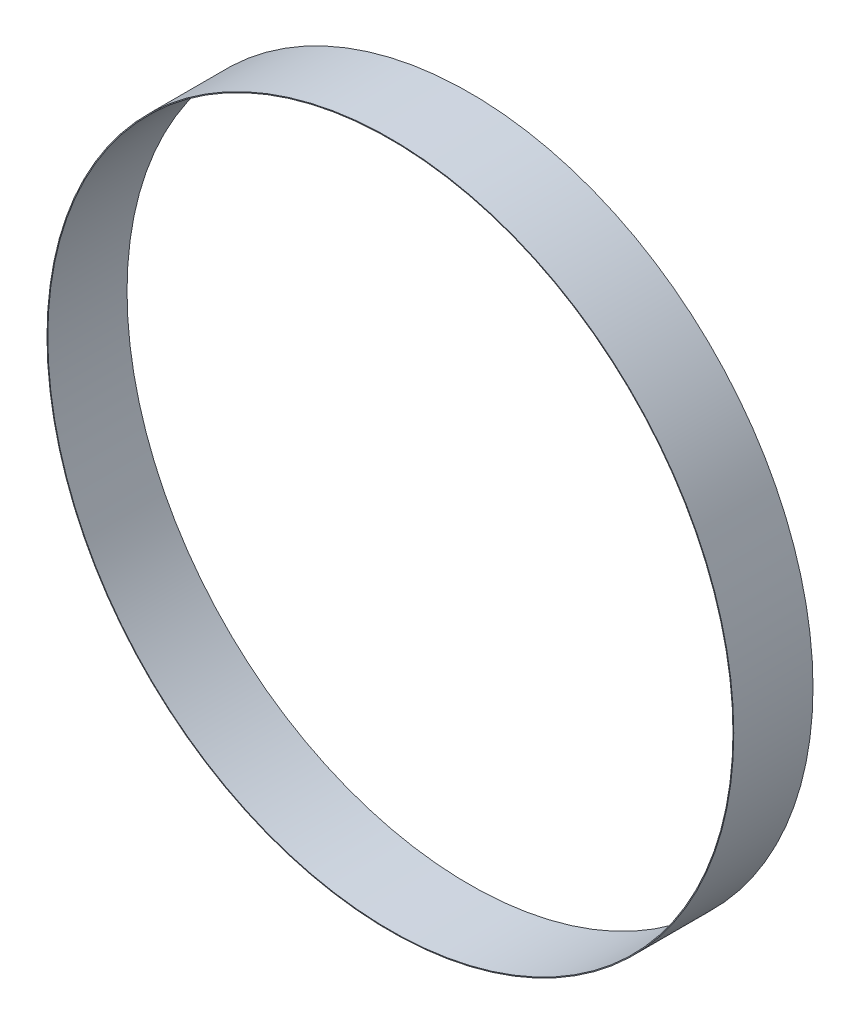
ISO-10303-21;
HEADER;
FILE_DESCRIPTION(('STEP AP214'),'2;1');
FILE_NAME('part.step','',(''),(''),'','','');
FILE_SCHEMA(('AUTOMOTIVE_DESIGN { 1 0 10303 214 1 1 1 1 }'));
ENDSEC;
DATA;
#1=APPLICATION_CONTEXT('core data for automotive mechanical design processes');
#2=APPLICATION_PROTOCOL_DEFINITION('international standard','automotive_design',2000,#1);
#3=PRODUCT_CONTEXT('',#1,'mechanical');
#4=PRODUCT('Part','Part','',(#3));
#5=PRODUCT_RELATED_PRODUCT_CATEGORY('part','',(#4));
#6=PRODUCT_DEFINITION_FORMATION('','',#4);
#7=PRODUCT_DEFINITION_CONTEXT('part definition',#1,'design');
#8=PRODUCT_DEFINITION('design','',#6,#7);
#9=PRODUCT_DEFINITION_SHAPE('','',#8);
#10=(LENGTH_UNIT() NAMED_UNIT(*) SI_UNIT(.MILLI.,.METRE.));
#11=(NAMED_UNIT(*) PLANE_ANGLE_UNIT() SI_UNIT($,.RADIAN.));
#12=(NAMED_UNIT(*) SI_UNIT($,.STERADIAN.) SOLID_ANGLE_UNIT());
#13=UNCERTAINTY_MEASURE_WITH_UNIT(LENGTH_MEASURE(1.E-05),#10,'distance_accuracy_value','');
#14=(GEOMETRIC_REPRESENTATION_CONTEXT(3) GLOBAL_UNCERTAINTY_ASSIGNED_CONTEXT((#13)) GLOBAL_UNIT_ASSIGNED_CONTEXT((#10,
#11,#12)) REPRESENTATION_CONTEXT('',''));
#15=CARTESIAN_POINT('',(0.,0.,0.));
#16=DIRECTION('',(0.,0.,1.));
#17=DIRECTION('',(1.,0.,0.));
#18=AXIS2_PLACEMENT_3D('',#15,#16,#17);
#19=CARTESIAN_POINT('',(0.,0.,150.));
#20=DIRECTION('',(0.,0.,1.));
#21=DIRECTION('',(1.,0.,0.));
#22=AXIS2_PLACEMENT_3D('',#19,#20,#21);
#23=PLANE('',#22);
#24=CARTESIAN_POINT('',(0.,0.,150.));
#25=DIRECTION('',(0.,0.,1.));
#26=DIRECTION('',(1.,0.,0.));
#27=AXIS2_PLACEMENT_3D('',#24,#25,#26);
#28=CIRCLE('',#27,1300.);
#29=CARTESIAN_POINT('',(1300.,0.,150.));
#30=VERTEX_POINT('',#29);
#31=EDGE_CURVE('E11',#30,#30,#28,.T.);
#32=ORIENTED_EDGE('',*,*,#31,.T.);
#33=EDGE_LOOP('',(#32));
#34=FACE_BOUND('',#33,.T.);
#35=CARTESIAN_POINT('',(0.,0.,150.));
#36=DIRECTION('',(0.,0.,1.));
#37=DIRECTION('',(1.,0.,0.));
#38=AXIS2_PLACEMENT_3D('',#35,#36,#37);
#39=CIRCLE('',#38,1297.);
#40=CARTESIAN_POINT('',(1297.,0.,150.));
#41=VERTEX_POINT('',#40);
#42=EDGE_CURVE('E52',#41,#41,#39,.T.);
#43=ORIENTED_EDGE('',*,*,#42,.F.);
#44=EDGE_LOOP('',(#43));
#45=FACE_BOUND('',#44,.T.);
#46=ADVANCED_FACE('F41',(#34,#45),#23,.T.);
#47=CARTESIAN_POINT('',(0.,0.,-150.));
#48=DIRECTION('',(0.,0.,1.));
#49=DIRECTION('',(1.,0.,0.));
#50=AXIS2_PLACEMENT_3D('',#47,#48,#49);
#51=PLANE('',#50);
#52=CARTESIAN_POINT('',(0.,0.,-150.));
#53=DIRECTION('',(0.,0.,1.));
#54=DIRECTION('',(1.,0.,0.));
#55=AXIS2_PLACEMENT_3D('',#52,#53,#54);
#56=CIRCLE('',#55,1300.);
#57=CARTESIAN_POINT('',(1300.,0.,-150.));
#58=VERTEX_POINT('',#57);
#59=EDGE_CURVE('E45',#58,#58,#56,.T.);
#60=ORIENTED_EDGE('',*,*,#59,.F.);
#61=EDGE_LOOP('',(#60));
#62=FACE_BOUND('',#61,.T.);
#63=CARTESIAN_POINT('',(0.,0.,-150.));
#64=DIRECTION('',(0.,0.,1.));
#65=DIRECTION('',(1.,0.,0.));
#66=AXIS2_PLACEMENT_3D('',#63,#64,#65);
#67=CIRCLE('',#66,1297.);
#68=CARTESIAN_POINT('',(1297.,0.,-150.));
#69=VERTEX_POINT('',#68);
#70=EDGE_CURVE('E54',#69,#69,#67,.T.);
#71=ORIENTED_EDGE('',*,*,#70,.T.);
#72=EDGE_LOOP('',(#71));
#73=FACE_BOUND('',#72,.T.);
#74=ADVANCED_FACE('F64',(#62,#73),#51,.F.);
#75=CARTESIAN_POINT('',(0.,0.,150.));
#76=DIRECTION('',(0.,0.,-1.));
#77=DIRECTION('',(-1.,0.,0.));
#78=AXIS2_PLACEMENT_3D('',#75,#76,#77);
#79=CYLINDRICAL_SURFACE('',#78,1300.);
#80=ORIENTED_EDGE('',*,*,#31,.F.);
#81=EDGE_LOOP('',(#80));
#82=FACE_BOUND('',#81,.T.);
#83=ORIENTED_EDGE('',*,*,#59,.T.);
#84=EDGE_LOOP('',(#83));
#85=FACE_BOUND('',#84,.T.);
#86=ADVANCED_FACE('F43',(#82,#85),#79,.T.);
#87=CARTESIAN_POINT('',(0.,0.,150.));
#88=DIRECTION('',(0.,0.,-1.));
#89=DIRECTION('',(-1.,0.,0.));
#90=AXIS2_PLACEMENT_3D('',#87,#88,#89);
#91=CYLINDRICAL_SURFACE('',#90,1297.);
#92=ORIENTED_EDGE('',*,*,#42,.T.);
#93=EDGE_LOOP('',(#92));
#94=FACE_BOUND('',#93,.T.);
#95=ORIENTED_EDGE('',*,*,#70,.F.);
#96=EDGE_LOOP('',(#95));
#97=FACE_BOUND('',#96,.T.);
#98=ADVANCED_FACE('F60',(#94,#97),#91,.F.);
#99=CLOSED_SHELL('',(#46,#74,#86,#98));
#100=MANIFOLD_SOLID_BREP('B2',#99);
#101=ADVANCED_BREP_SHAPE_REPRESENTATION('',(#18,#100),#14);
#102=SHAPE_DEFINITION_REPRESENTATION(#9,#101);
ENDSEC;
END-ISO-10303-21;
